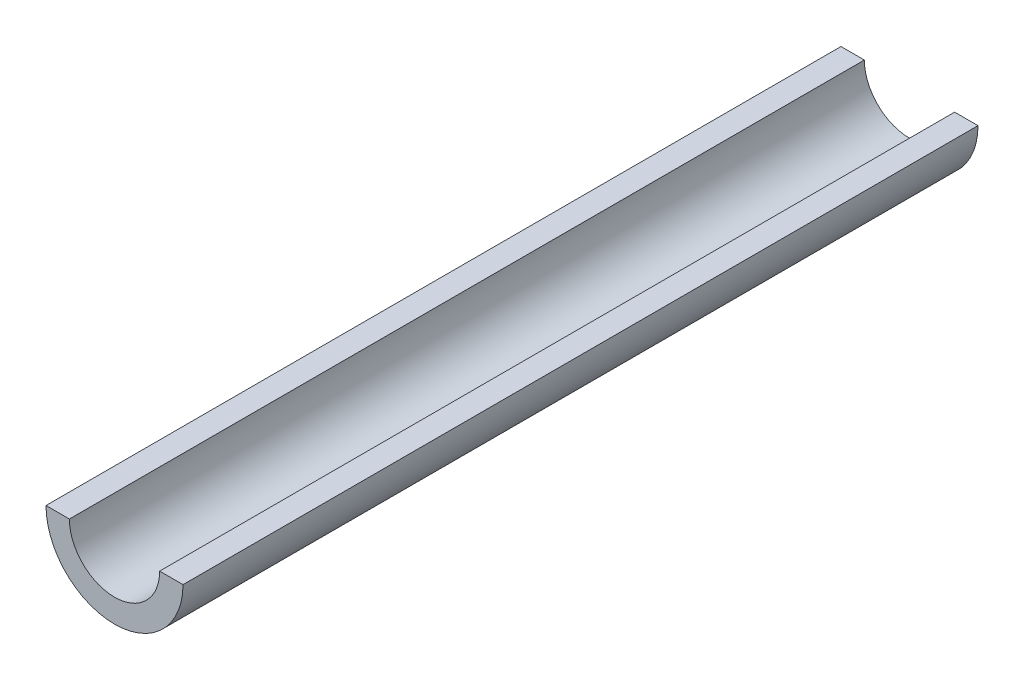
ISO-10303-21;
HEADER;
FILE_DESCRIPTION(('STEP AP214'),'2;1');
FILE_NAME('part.step','',(''),(''),'','','');
FILE_SCHEMA(('AUTOMOTIVE_DESIGN { 1 0 10303 214 1 1 1 1 }'));
ENDSEC;
DATA;
#1=APPLICATION_CONTEXT('core data for automotive mechanical design processes');
#2=APPLICATION_PROTOCOL_DEFINITION('international standard','automotive_design',2000,#1);
#3=PRODUCT_CONTEXT('',#1,'mechanical');
#4=PRODUCT('Part','Part','',(#3));
#5=PRODUCT_RELATED_PRODUCT_CATEGORY('part','',(#4));
#6=PRODUCT_DEFINITION_FORMATION('','',#4);
#7=PRODUCT_DEFINITION_CONTEXT('part definition',#1,'design');
#8=PRODUCT_DEFINITION('design','',#6,#7);
#9=PRODUCT_DEFINITION_SHAPE('','',#8);
#10=(LENGTH_UNIT() NAMED_UNIT(*) SI_UNIT(.MILLI.,.METRE.));
#11=(NAMED_UNIT(*) PLANE_ANGLE_UNIT() SI_UNIT($,.RADIAN.));
#12=(NAMED_UNIT(*) SI_UNIT($,.STERADIAN.) SOLID_ANGLE_UNIT());
#13=UNCERTAINTY_MEASURE_WITH_UNIT(LENGTH_MEASURE(1.E-05),#10,'distance_accuracy_value','');
#14=(GEOMETRIC_REPRESENTATION_CONTEXT(3) GLOBAL_UNCERTAINTY_ASSIGNED_CONTEXT((#13)) GLOBAL_UNIT_ASSIGNED_CONTEXT((#10,
#11,#12)) REPRESENTATION_CONTEXT('',''));
#15=CARTESIAN_POINT('',(0.,0.,0.));
#16=DIRECTION('',(0.,0.,1.));
#17=DIRECTION('',(1.,0.,0.));
#18=AXIS2_PLACEMENT_3D('',#15,#16,#17);
#19=CARTESIAN_POINT('',(0.,0.,170.));
#20=DIRECTION('',(0.,0.,-1.));
#21=DIRECTION('',(-1.,0.,0.));
#22=AXIS2_PLACEMENT_3D('',#19,#20,#21);
#23=CYLINDRICAL_SURFACE('',#22,14.65);
#24=CARTESIAN_POINT('',(0.,0.,0.));
#25=DIRECTION('',(0.,0.,1.));
#26=DIRECTION('',(1.,0.,0.));
#27=AXIS2_PLACEMENT_3D('',#24,#25,#26);
#28=CIRCLE('',#27,14.65);
#29=CARTESIAN_POINT('',(-14.65,0.,0.));
#30=VERTEX_POINT('',#29);
#31=CARTESIAN_POINT('',(14.65,0.,0.));
#32=VERTEX_POINT('',#31);
#33=EDGE_CURVE('E107',#30,#32,#28,.T.);
#34=ORIENTED_EDGE('',*,*,#33,.T.);
#35=DIRECTION('',(0.,0.,-1.));
#36=VECTOR('',#35,1.);
#37=CARTESIAN_POINT('',(14.65,0.,170.));
#38=LINE('',#37,#36);
#39=CARTESIAN_POINT('',(14.65,0.,170.));
#40=VERTEX_POINT('',#39);
#41=EDGE_CURVE('E11',#40,#32,#38,.T.);
#42=ORIENTED_EDGE('',*,*,#41,.F.);
#43=CARTESIAN_POINT('',(0.,0.,170.));
#44=DIRECTION('',(0.,0.,1.));
#45=DIRECTION('',(1.,0.,0.));
#46=AXIS2_PLACEMENT_3D('',#43,#44,#45);
#47=CIRCLE('',#46,14.65);
#48=CARTESIAN_POINT('',(-14.65,0.,170.));
#49=VERTEX_POINT('',#48);
#50=EDGE_CURVE('E91',#49,#40,#47,.T.);
#51=ORIENTED_EDGE('',*,*,#50,.F.);
#52=DIRECTION('',(0.,0.,-1.));
#53=VECTOR('',#52,1.);
#54=CARTESIAN_POINT('',(-14.65,0.,170.));
#55=LINE('',#54,#53);
#56=EDGE_CURVE('E103',#49,#30,#55,.T.);
#57=ORIENTED_EDGE('',*,*,#56,.T.);
#58=EDGE_LOOP('',(#34,#42,#51,#57));
#59=FACE_BOUND('',#58,.T.);
#60=ADVANCED_FACE('F39',(#59),#23,.T.);
#61=CARTESIAN_POINT('',(14.65,0.,170.));
#62=DIRECTION('',(0.,-1.,0.));
#63=DIRECTION('',(1.,0.,0.));
#64=AXIS2_PLACEMENT_3D('',#61,#62,#63);
#65=PLANE('',#64);
#66=DIRECTION('',(-1.,0.,0.));
#67=VECTOR('',#66,1.);
#68=CARTESIAN_POINT('',(14.65,0.,0.));
#69=LINE('',#68,#67);
#70=CARTESIAN_POINT('',(9.65,0.,0.));
#71=VERTEX_POINT('',#70);
#72=EDGE_CURVE('E96',#32,#71,#69,.T.);
#73=ORIENTED_EDGE('',*,*,#72,.T.);
#74=DIRECTION('',(0.,0.,-1.));
#75=VECTOR('',#74,1.);
#76=CARTESIAN_POINT('',(9.65,0.,170.));
#77=LINE('',#76,#75);
#78=CARTESIAN_POINT('',(9.65,0.,170.));
#79=VERTEX_POINT('',#78);
#80=EDGE_CURVE('E48',#79,#71,#77,.T.);
#81=ORIENTED_EDGE('',*,*,#80,.F.);
#82=DIRECTION('',(-1.,0.,0.));
#83=VECTOR('',#82,1.);
#84=CARTESIAN_POINT('',(14.65,0.,170.));
#85=LINE('',#84,#83);
#86=EDGE_CURVE('E86',#40,#79,#85,.T.);
#87=ORIENTED_EDGE('',*,*,#86,.F.);
#88=ORIENTED_EDGE('',*,*,#41,.T.);
#89=EDGE_LOOP('',(#73,#81,#87,#88));
#90=FACE_BOUND('',#89,.T.);
#91=ADVANCED_FACE('F95',(#90),#65,.F.);
#92=CARTESIAN_POINT('',(0.,0.,170.));
#93=DIRECTION('',(0.,0.,-1.));
#94=DIRECTION('',(-1.,0.,0.));
#95=AXIS2_PLACEMENT_3D('',#92,#93,#94);
#96=CYLINDRICAL_SURFACE('',#95,9.65);
#97=CARTESIAN_POINT('',(0.,0.,0.));
#98=DIRECTION('',(0.,0.,-1.));
#99=DIRECTION('',(1.,0.,0.));
#100=AXIS2_PLACEMENT_3D('',#97,#98,#99);
#101=CIRCLE('',#100,9.65);
#102=CARTESIAN_POINT('',(-9.65,0.,0.));
#103=VERTEX_POINT('',#102);
#104=EDGE_CURVE('E73',#71,#103,#101,.T.);
#105=ORIENTED_EDGE('',*,*,#104,.T.);
#106=DIRECTION('',(0.,0.,-1.));
#107=VECTOR('',#106,1.);
#108=CARTESIAN_POINT('',(-9.65,0.,170.));
#109=LINE('',#108,#107);
#110=CARTESIAN_POINT('',(-9.65,0.,170.));
#111=VERTEX_POINT('',#110);
#112=EDGE_CURVE('E98',#111,#103,#109,.T.);
#113=ORIENTED_EDGE('',*,*,#112,.F.);
#114=CARTESIAN_POINT('',(0.,0.,170.));
#115=DIRECTION('',(0.,0.,-1.));
#116=DIRECTION('',(1.,0.,0.));
#117=AXIS2_PLACEMENT_3D('',#114,#115,#116);
#118=CIRCLE('',#117,9.65);
#119=EDGE_CURVE('E89',#79,#111,#118,.T.);
#120=ORIENTED_EDGE('',*,*,#119,.F.);
#121=ORIENTED_EDGE('',*,*,#80,.T.);
#122=EDGE_LOOP('',(#105,#113,#120,#121));
#123=FACE_BOUND('',#122,.T.);
#124=ADVANCED_FACE('F99',(#123),#96,.F.);
#125=CARTESIAN_POINT('',(-9.65,0.,170.));
#126=DIRECTION('',(0.,-1.,0.));
#127=DIRECTION('',(1.,0.,0.));
#128=AXIS2_PLACEMENT_3D('',#125,#126,#127);
#129=PLANE('',#128);
#130=DIRECTION('',(-1.,0.,0.));
#131=VECTOR('',#130,1.);
#132=CARTESIAN_POINT('',(-9.65,0.,0.));
#133=LINE('',#132,#131);
#134=EDGE_CURVE('E79',#103,#30,#133,.T.);
#135=ORIENTED_EDGE('',*,*,#134,.T.);
#136=ORIENTED_EDGE('',*,*,#56,.F.);
#137=DIRECTION('',(-1.,0.,0.));
#138=VECTOR('',#137,1.);
#139=CARTESIAN_POINT('',(-9.65,0.,170.));
#140=LINE('',#139,#138);
#141=EDGE_CURVE('E56',#111,#49,#140,.T.);
#142=ORIENTED_EDGE('',*,*,#141,.F.);
#143=ORIENTED_EDGE('',*,*,#112,.T.);
#144=EDGE_LOOP('',(#135,#136,#142,#143));
#145=FACE_BOUND('',#144,.T.);
#146=ADVANCED_FACE('F120',(#145),#129,.F.);
#147=CARTESIAN_POINT('',(0.,0.,170.));
#148=DIRECTION('',(0.,0.,1.));
#149=DIRECTION('',(1.,0.,0.));
#150=AXIS2_PLACEMENT_3D('',#147,#148,#149);
#151=PLANE('',#150);
#152=ORIENTED_EDGE('',*,*,#50,.T.);
#153=ORIENTED_EDGE('',*,*,#86,.T.);
#154=ORIENTED_EDGE('',*,*,#119,.T.);
#155=ORIENTED_EDGE('',*,*,#141,.T.);
#156=EDGE_LOOP('',(#152,#153,#154,#155));
#157=FACE_BOUND('',#156,.T.);
#158=ADVANCED_FACE('F87',(#157),#151,.T.);
#159=CARTESIAN_POINT('',(0.,0.,0.));
#160=DIRECTION('',(0.,0.,1.));
#161=DIRECTION('',(1.,0.,0.));
#162=AXIS2_PLACEMENT_3D('',#159,#160,#161);
#163=PLANE('',#162);
#164=ORIENTED_EDGE('',*,*,#33,.F.);
#165=ORIENTED_EDGE('',*,*,#134,.F.);
#166=ORIENTED_EDGE('',*,*,#104,.F.);
#167=ORIENTED_EDGE('',*,*,#72,.F.);
#168=EDGE_LOOP('',(#164,#165,#166,#167));
#169=FACE_BOUND('',#168,.T.);
#170=ADVANCED_FACE('F123',(#169),#163,.F.);
#171=CLOSED_SHELL('',(#60,#91,#124,#146,#158,#170));
#172=MANIFOLD_SOLID_BREP('B2',#171);
#173=ADVANCED_BREP_SHAPE_REPRESENTATION('',(#18,#172),#14);
#174=SHAPE_DEFINITION_REPRESENTATION(#9,#173);
ENDSEC;
END-ISO-10303-21;
